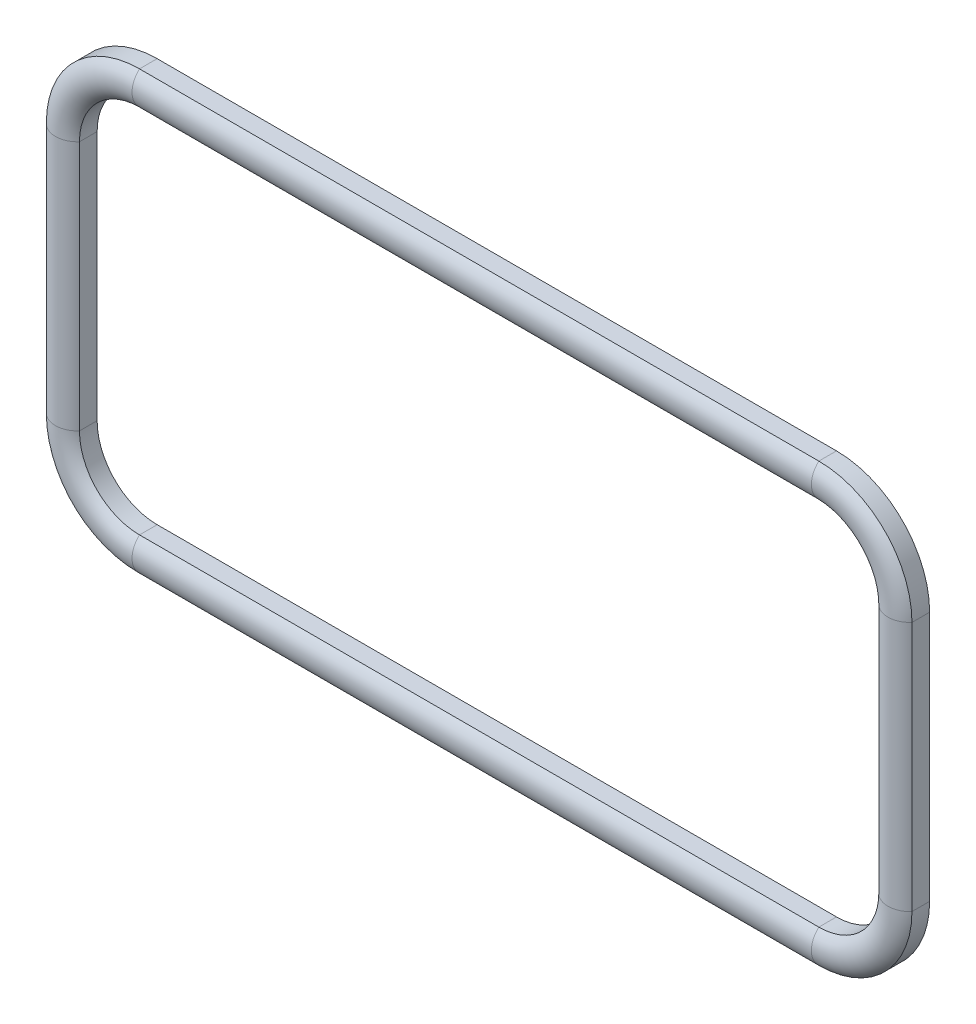
ISO-10303-21;
HEADER;
FILE_DESCRIPTION(('STEP AP214'),'2;1');
FILE_NAME('part.step','',(''),(''),'','','');
FILE_SCHEMA(('AUTOMOTIVE_DESIGN { 1 0 10303 214 1 1 1 1 }'));
ENDSEC;
DATA;
#1=APPLICATION_CONTEXT('core data for automotive mechanical design processes');
#2=APPLICATION_PROTOCOL_DEFINITION('international standard','automotive_design',2000,#1);
#3=PRODUCT_CONTEXT('',#1,'mechanical');
#4=PRODUCT('Part','Part','',(#3));
#5=PRODUCT_RELATED_PRODUCT_CATEGORY('part','',(#4));
#6=PRODUCT_DEFINITION_FORMATION('','',#4);
#7=PRODUCT_DEFINITION_CONTEXT('part definition',#1,'design');
#8=PRODUCT_DEFINITION('design','',#6,#7);
#9=PRODUCT_DEFINITION_SHAPE('','',#8);
#10=(LENGTH_UNIT() NAMED_UNIT(*) SI_UNIT(.MILLI.,.METRE.));
#11=(NAMED_UNIT(*) PLANE_ANGLE_UNIT() SI_UNIT($,.RADIAN.));
#12=(NAMED_UNIT(*) SI_UNIT($,.STERADIAN.) SOLID_ANGLE_UNIT());
#13=UNCERTAINTY_MEASURE_WITH_UNIT(LENGTH_MEASURE(1.E-05),#10,'distance_accuracy_value','');
#14=(GEOMETRIC_REPRESENTATION_CONTEXT(3) GLOBAL_UNCERTAINTY_ASSIGNED_CONTEXT((#13)) GLOBAL_UNIT_ASSIGNED_CONTEXT((#10,
#11,#12)) REPRESENTATION_CONTEXT('',''));
#15=CARTESIAN_POINT('',(0.,0.,0.));
#16=DIRECTION('',(0.,0.,1.));
#17=DIRECTION('',(1.,0.,0.));
#18=AXIS2_PLACEMENT_3D('',#15,#16,#17);
#19=CARTESIAN_POINT('',(-17.9451,-5.39749999999998,-0.224392713165355));
#20=DIRECTION('',(0.,1.,0.));
#21=DIRECTION('',(0.,0.,1.));
#22=AXIS2_PLACEMENT_3D('',#19,#20,#21);
#23=CYLINDRICAL_SURFACE('',#22,0.952336168749449);
#24=DIRECTION('',(0.,1.,0.));
#25=VECTOR('',#24,1.);
#26=CARTESIAN_POINT('',(-17.2316262924775,-5.39749999999998,0.4064));
#27=LINE('',#26,#25);
#28=CARTESIAN_POINT('',(-17.2316262924775,5.39750000000001,0.406399999999999));
#29=VERTEX_POINT('',#28);
#30=CARTESIAN_POINT('',(-17.2316262924775,-5.39749999999998,0.4064));
#31=VERTEX_POINT('',#30);
#32=EDGE_CURVE('E138',#29,#31,#27,.F.);
#33=ORIENTED_EDGE('',*,*,#32,.F.);
#34=CARTESIAN_POINT('',(-17.9451,5.39749999999998,-0.224392713165355));
#35=DIRECTION('',(0.,-1.,0.));
#36=DIRECTION('',(-1.,0.,0.));
#37=AXIS2_PLACEMENT_3D('',#34,#35,#36);
#38=CIRCLE('',#37,0.952336168749449);
#39=CARTESIAN_POINT('',(-18.6585737075225,5.39749999999995,0.4064));
#40=VERTEX_POINT('',#39);
#41=EDGE_CURVE('E294',#40,#29,#38,.F.);
#42=ORIENTED_EDGE('',*,*,#41,.F.);
#43=DIRECTION('',(0.,1.,0.));
#44=VECTOR('',#43,1.);
#45=CARTESIAN_POINT('',(-18.6585737075225,-5.39749999999998,0.4064));
#46=LINE('',#45,#44);
#47=CARTESIAN_POINT('',(-18.6585737075225,-5.39749999999998,0.4064));
#48=VERTEX_POINT('',#47);
#49=EDGE_CURVE('E141',#48,#40,#46,.T.);
#50=ORIENTED_EDGE('',*,*,#49,.F.);
#51=CARTESIAN_POINT('',(-17.9451,-5.39749999999997,-0.224392713165355));
#52=DIRECTION('',(0.,-1.,0.));
#53=DIRECTION('',(-1.,0.,0.));
#54=AXIS2_PLACEMENT_3D('',#51,#52,#53);
#55=CIRCLE('',#54,0.952336168749449);
#56=EDGE_CURVE('E134',#31,#48,#55,.T.);
#57=ORIENTED_EDGE('',*,*,#56,.F.);
#58=EDGE_LOOP('',(#33,#42,#50,#57));
#59=FACE_BOUND('',#58,.T.);
#60=ADVANCED_FACE('F16',(#59),#23,.T.);
#61=CARTESIAN_POINT('',(-14.6431,-5.3975,-0.224392713165355));
#62=DIRECTION('',(0.,0.,1.));
#63=DIRECTION('',(1.,0.,0.));
#64=AXIS2_PLACEMENT_3D('',#61,#62,#63);
#65=TOROIDAL_SURFACE('',#64,3.302,0.952336168749449);
#66=CARTESIAN_POINT('',(-14.6431,-5.3975,0.4064));
#67=DIRECTION('',(0.,0.,1.));
#68=DIRECTION('',(1.,0.,0.));
#69=AXIS2_PLACEMENT_3D('',#66,#67,#68);
#70=CIRCLE('',#69,2.58852629247752);
#71=CARTESIAN_POINT('',(-14.6431,-7.98602629247752,0.4064));
#72=VERTEX_POINT('',#71);
#73=EDGE_CURVE('E147',#72,#31,#70,.F.);
#74=ORIENTED_EDGE('',*,*,#73,.T.);
#75=ORIENTED_EDGE('',*,*,#56,.T.);
#76=CARTESIAN_POINT('',(-14.6431,-5.3975,0.4064));
#77=DIRECTION('',(0.,0.,1.));
#78=DIRECTION('',(1.,0.,0.));
#79=AXIS2_PLACEMENT_3D('',#76,#77,#78);
#80=CIRCLE('',#79,4.01547370752248);
#81=CARTESIAN_POINT('',(-14.6431,-9.41297370752248,0.4064));
#82=VERTEX_POINT('',#81);
#83=EDGE_CURVE('E292',#82,#48,#80,.F.);
#84=ORIENTED_EDGE('',*,*,#83,.F.);
#85=CARTESIAN_POINT('',(-14.6431,-8.6995,-0.224392713165355));
#86=DIRECTION('',(1.,0.,0.));
#87=DIRECTION('',(0.,1.,0.));
#88=AXIS2_PLACEMENT_3D('',#85,#86,#87);
#89=CIRCLE('',#88,0.952336168749449);
#90=EDGE_CURVE('E144',#72,#82,#89,.T.);
#91=ORIENTED_EDGE('',*,*,#90,.F.);
#92=EDGE_LOOP('',(#74,#75,#84,#91));
#93=FACE_BOUND('',#92,.T.);
#94=ADVANCED_FACE('F148',(#93),#65,.T.);
#95=CARTESIAN_POINT('',(-14.6431,-8.6995,-0.224392713165355));
#96=DIRECTION('',(1.,0.,0.));
#97=DIRECTION('',(0.,1.,0.));
#98=AXIS2_PLACEMENT_3D('',#95,#96,#97);
#99=CYLINDRICAL_SURFACE('',#98,0.952336168749449);
#100=CARTESIAN_POINT('',(14.6431,-8.6995,-0.224392713165355));
#101=DIRECTION('',(1.,0.,0.));
#102=DIRECTION('',(0.,-1.,0.));
#103=AXIS2_PLACEMENT_3D('',#100,#101,#102);
#104=CIRCLE('',#103,0.952336168749449);
#105=CARTESIAN_POINT('',(14.6431,-7.98602629247752,0.4064));
#106=VERTEX_POINT('',#105);
#107=CARTESIAN_POINT('',(14.6431,-9.41297370752248,0.4064));
#108=VERTEX_POINT('',#107);
#109=EDGE_CURVE('E268',#106,#108,#104,.T.);
#110=ORIENTED_EDGE('',*,*,#109,.F.);
#111=DIRECTION('',(1.,0.,0.));
#112=VECTOR('',#111,1.);
#113=CARTESIAN_POINT('',(-14.6431,-7.98602629247752,0.4064));
#114=LINE('',#113,#112);
#115=EDGE_CURVE('E168',#106,#72,#114,.F.);
#116=ORIENTED_EDGE('',*,*,#115,.T.);
#117=ORIENTED_EDGE('',*,*,#90,.T.);
#118=DIRECTION('',(-1.,0.,0.));
#119=VECTOR('',#118,1.);
#120=CARTESIAN_POINT('',(-14.6431,-9.41297370752248,0.4064));
#121=LINE('',#120,#119);
#122=EDGE_CURVE('E180',#82,#108,#121,.F.);
#123=ORIENTED_EDGE('',*,*,#122,.T.);
#124=EDGE_LOOP('',(#110,#116,#117,#123));
#125=FACE_BOUND('',#124,.T.);
#126=ADVANCED_FACE('F279',(#125),#99,.T.);
#127=CARTESIAN_POINT('',(14.6431,-5.3975,-0.224392713165355));
#128=DIRECTION('',(0.,0.,1.));
#129=DIRECTION('',(1.,0.,0.));
#130=AXIS2_PLACEMENT_3D('',#127,#128,#129);
#131=TOROIDAL_SURFACE('',#130,3.302,0.952336168749449);
#132=CARTESIAN_POINT('',(17.9451,-5.3975,-0.224392713165355));
#133=DIRECTION('',(0.,1.,0.));
#134=DIRECTION('',(0.,0.,1.));
#135=AXIS2_PLACEMENT_3D('',#132,#133,#134);
#136=CIRCLE('',#135,0.952336168749449);
#137=CARTESIAN_POINT('',(17.2316262924775,-5.3975,0.4064));
#138=VERTEX_POINT('',#137);
#139=CARTESIAN_POINT('',(18.6585737075225,-5.39749999999999,0.4064));
#140=VERTEX_POINT('',#139);
#141=EDGE_CURVE('E258',#138,#140,#136,.T.);
#142=ORIENTED_EDGE('',*,*,#141,.F.);
#143=CARTESIAN_POINT('',(14.6431,-5.3975,0.4064));
#144=DIRECTION('',(0.,0.,1.));
#145=DIRECTION('',(1.,0.,0.));
#146=AXIS2_PLACEMENT_3D('',#143,#144,#145);
#147=CIRCLE('',#146,2.58852629247752);
#148=EDGE_CURVE('E261',#138,#106,#147,.F.);
#149=ORIENTED_EDGE('',*,*,#148,.T.);
#150=ORIENTED_EDGE('',*,*,#109,.T.);
#151=CARTESIAN_POINT('',(14.6431,-5.3975,0.4064));
#152=DIRECTION('',(0.,0.,1.));
#153=DIRECTION('',(1.,0.,0.));
#154=AXIS2_PLACEMENT_3D('',#151,#152,#153);
#155=CIRCLE('',#154,4.01547370752248);
#156=EDGE_CURVE('E189',#140,#108,#155,.F.);
#157=ORIENTED_EDGE('',*,*,#156,.F.);
#158=EDGE_LOOP('',(#142,#149,#150,#157));
#159=FACE_BOUND('',#158,.T.);
#160=ADVANCED_FACE('F276',(#159),#131,.T.);
#161=CARTESIAN_POINT('',(17.9451,-5.39749999999998,-0.224392713165355));
#162=DIRECTION('',(0.,1.,0.));
#163=DIRECTION('',(0.,0.,1.));
#164=AXIS2_PLACEMENT_3D('',#161,#162,#163);
#165=CYLINDRICAL_SURFACE('',#164,0.952336168749449);
#166=CARTESIAN_POINT('',(17.9451,5.3975,-0.224392713165355));
#167=DIRECTION('',(0.,1.,0.));
#168=DIRECTION('',(1.,0.,0.));
#169=AXIS2_PLACEMENT_3D('',#166,#167,#168);
#170=CIRCLE('',#169,0.952336168749449);
#171=CARTESIAN_POINT('',(17.2316262924775,5.3975,0.4064));
#172=VERTEX_POINT('',#171);
#173=CARTESIAN_POINT('',(18.6585737075225,5.3975,0.4064));
#174=VERTEX_POINT('',#173);
#175=EDGE_CURVE('E255',#172,#174,#170,.T.);
#176=ORIENTED_EDGE('',*,*,#175,.F.);
#177=DIRECTION('',(0.,1.,0.));
#178=VECTOR('',#177,1.);
#179=CARTESIAN_POINT('',(17.2316262924775,-5.3975,0.4064));
#180=LINE('',#179,#178);
#181=EDGE_CURVE('E368',#172,#138,#180,.F.);
#182=ORIENTED_EDGE('',*,*,#181,.T.);
#183=ORIENTED_EDGE('',*,*,#141,.T.);
#184=DIRECTION('',(0.,1.,0.));
#185=VECTOR('',#184,1.);
#186=CARTESIAN_POINT('',(18.6585737075225,-5.39749999999996,0.4064));
#187=LINE('',#186,#185);
#188=EDGE_CURVE('E194',#140,#174,#187,.T.);
#189=ORIENTED_EDGE('',*,*,#188,.T.);
#190=EDGE_LOOP('',(#176,#182,#183,#189));
#191=FACE_BOUND('',#190,.T.);
#192=ADVANCED_FACE('F247',(#191),#165,.T.);
#193=CARTESIAN_POINT('',(14.6431,5.3975,-0.224392713165355));
#194=DIRECTION('',(0.,0.,1.));
#195=DIRECTION('',(1.,0.,0.));
#196=AXIS2_PLACEMENT_3D('',#193,#194,#195);
#197=TOROIDAL_SURFACE('',#196,3.302,0.952336168749449);
#198=CARTESIAN_POINT('',(14.6431,5.3975,0.4064));
#199=DIRECTION('',(0.,0.,1.));
#200=DIRECTION('',(1.,0.,0.));
#201=AXIS2_PLACEMENT_3D('',#198,#199,#200);
#202=CIRCLE('',#201,2.58852629247753);
#203=CARTESIAN_POINT('',(14.6431,7.98602629247753,0.4064));
#204=VERTEX_POINT('',#203);
#205=EDGE_CURVE('E363',#204,#172,#202,.F.);
#206=ORIENTED_EDGE('',*,*,#205,.T.);
#207=ORIENTED_EDGE('',*,*,#175,.T.);
#208=CARTESIAN_POINT('',(14.6431,5.3975,0.4064));
#209=DIRECTION('',(0.,0.,1.));
#210=DIRECTION('',(1.,0.,0.));
#211=AXIS2_PLACEMENT_3D('',#208,#209,#210);
#212=CIRCLE('',#211,4.01547370752248);
#213=CARTESIAN_POINT('',(14.6431,9.41297370752248,0.4064));
#214=VERTEX_POINT('',#213);
#215=EDGE_CURVE('E200',#214,#174,#212,.F.);
#216=ORIENTED_EDGE('',*,*,#215,.F.);
#217=CARTESIAN_POINT('',(14.6431,8.69950000000001,-0.224392713165355));
#218=DIRECTION('',(-1.,0.,0.));
#219=DIRECTION('',(0.,-1.,0.));
#220=AXIS2_PLACEMENT_3D('',#217,#218,#219);
#221=CIRCLE('',#220,0.952336168749449);
#222=EDGE_CURVE('E257',#204,#214,#221,.T.);
#223=ORIENTED_EDGE('',*,*,#222,.F.);
#224=EDGE_LOOP('',(#206,#207,#216,#223));
#225=FACE_BOUND('',#224,.T.);
#226=ADVANCED_FACE('F243',(#225),#197,.T.);
#227=CARTESIAN_POINT('',(14.6431,8.69950000000001,-0.224392713165355));
#228=DIRECTION('',(-1.,0.,0.));
#229=DIRECTION('',(0.,-1.,0.));
#230=AXIS2_PLACEMENT_3D('',#227,#228,#229);
#231=CYLINDRICAL_SURFACE('',#230,0.952336168749449);
#232=CARTESIAN_POINT('',(-14.6430999999999,8.6995,-0.224392713165355));
#233=DIRECTION('',(-1.,0.,0.));
#234=DIRECTION('',(0.,1.,0.));
#235=AXIS2_PLACEMENT_3D('',#232,#233,#234);
#236=CIRCLE('',#235,0.952336168749449);
#237=CARTESIAN_POINT('',(-14.6430999999999,7.98602629247752,0.4064));
#238=VERTEX_POINT('',#237);
#239=CARTESIAN_POINT('',(-14.6431,9.41297370752248,0.4064));
#240=VERTEX_POINT('',#239);
#241=EDGE_CURVE('E92',#238,#240,#236,.T.);
#242=ORIENTED_EDGE('',*,*,#241,.F.);
#243=DIRECTION('',(-1.,0.,0.));
#244=VECTOR('',#243,1.);
#245=CARTESIAN_POINT('',(14.6431,7.98602629247753,0.4064));
#246=LINE('',#245,#244);
#247=EDGE_CURVE('E219',#238,#204,#246,.F.);
#248=ORIENTED_EDGE('',*,*,#247,.T.);
#249=ORIENTED_EDGE('',*,*,#222,.T.);
#250=DIRECTION('',(1.,0.,0.));
#251=VECTOR('',#250,1.);
#252=CARTESIAN_POINT('',(14.6431,9.41297370752248,0.4064));
#253=LINE('',#252,#251);
#254=EDGE_CURVE('E205',#214,#240,#253,.F.);
#255=ORIENTED_EDGE('',*,*,#254,.T.);
#256=EDGE_LOOP('',(#242,#248,#249,#255));
#257=FACE_BOUND('',#256,.T.);
#258=ADVANCED_FACE('F238',(#257),#231,.T.);
#259=CARTESIAN_POINT('',(-14.6431,5.3975,-0.224392713165355));
#260=DIRECTION('',(0.,0.,1.));
#261=DIRECTION('',(1.,0.,0.));
#262=AXIS2_PLACEMENT_3D('',#259,#260,#261);
#263=TOROIDAL_SURFACE('',#262,3.302,0.952336168749449);
#264=ORIENTED_EDGE('',*,*,#41,.T.);
#265=CARTESIAN_POINT('',(-14.6431,5.3975,0.4064));
#266=DIRECTION('',(0.,0.,1.));
#267=DIRECTION('',(1.,0.,0.));
#268=AXIS2_PLACEMENT_3D('',#265,#266,#267);
#269=CIRCLE('',#268,2.58852629247753);
#270=EDGE_CURVE('E225',#29,#238,#269,.F.);
#271=ORIENTED_EDGE('',*,*,#270,.T.);
#272=ORIENTED_EDGE('',*,*,#241,.T.);
#273=CARTESIAN_POINT('',(-14.6431,5.3975,0.4064));
#274=DIRECTION('',(0.,0.,1.));
#275=DIRECTION('',(1.,0.,0.));
#276=AXIS2_PLACEMENT_3D('',#273,#274,#275);
#277=CIRCLE('',#276,4.01547370752248);
#278=EDGE_CURVE('E211',#40,#240,#277,.F.);
#279=ORIENTED_EDGE('',*,*,#278,.F.);
#280=EDGE_LOOP('',(#264,#271,#272,#279));
#281=FACE_BOUND('',#280,.T.);
#282=ADVANCED_FACE('F233',(#281),#263,.T.);
#283=CARTESIAN_POINT('',(-14.6431,-5.3975,0.));
#284=DIRECTION('',(0.,0.,1.));
#285=DIRECTION('',(1.,0.,0.));
#286=AXIS2_PLACEMENT_3D('',#283,#284,#285);
#287=CYLINDRICAL_SURFACE('',#286,4.01547370752248);
#288=DIRECTION('',(0.,0.,1.));
#289=VECTOR('',#288,1.);
#290=CARTESIAN_POINT('',(-14.6431,-9.41297370752248,-0.3556));
#291=LINE('',#290,#289);
#292=CARTESIAN_POINT('',(-14.6431,-9.41297370752248,-0.3556));
#293=VERTEX_POINT('',#292);
#294=EDGE_CURVE('E162',#293,#82,#291,.T.);
#295=ORIENTED_EDGE('',*,*,#294,.T.);
#296=ORIENTED_EDGE('',*,*,#83,.T.);
#297=DIRECTION('',(0.,0.,1.));
#298=VECTOR('',#297,1.);
#299=CARTESIAN_POINT('',(-18.6585737075225,-5.39749999999998,-0.3556));
#300=LINE('',#299,#298);
#301=CARTESIAN_POINT('',(-18.6585737075225,-5.39749999999999,-0.3556));
#302=VERTEX_POINT('',#301);
#303=EDGE_CURVE('E212',#302,#48,#300,.T.);
#304=ORIENTED_EDGE('',*,*,#303,.F.);
#305=CARTESIAN_POINT('',(-14.6431,-5.3975,-0.3556));
#306=DIRECTION('',(0.,0.,1.));
#307=DIRECTION('',(1.,0.,0.));
#308=AXIS2_PLACEMENT_3D('',#305,#306,#307);
#309=CIRCLE('',#308,4.01547370752248);
#310=EDGE_CURVE('E19',#293,#302,#309,.F.);
#311=ORIENTED_EDGE('',*,*,#310,.F.);
#312=EDGE_LOOP('',(#295,#296,#304,#311));
#313=FACE_BOUND('',#312,.T.);
#314=ADVANCED_FACE('F237',(#313),#287,.T.);
#315=CARTESIAN_POINT('',(-18.6585737075225,-5.39749999999998,-0.3556));
#316=DIRECTION('',(-1.,0.,0.));
#317=DIRECTION('',(0.,0.,1.));
#318=AXIS2_PLACEMENT_3D('',#315,#316,#317);
#319=PLANE('',#318);
#320=DIRECTION('',(0.,1.,0.));
#321=VECTOR('',#320,1.);
#322=CARTESIAN_POINT('',(-18.6585737075225,-5.39749999999998,-0.3556));
#323=LINE('',#322,#321);
#324=CARTESIAN_POINT('',(-18.6585737075225,5.39749999999997,-0.3556));
#325=VERTEX_POINT('',#324);
#326=EDGE_CURVE('E343',#302,#325,#323,.T.);
#327=ORIENTED_EDGE('',*,*,#326,.F.);
#328=ORIENTED_EDGE('',*,*,#303,.T.);
#329=ORIENTED_EDGE('',*,*,#49,.T.);
#330=DIRECTION('',(0.,0.,1.));
#331=VECTOR('',#330,1.);
#332=CARTESIAN_POINT('',(-18.6585737075225,5.39749999999995,0.));
#333=LINE('',#332,#331);
#334=EDGE_CURVE('E208',#325,#40,#333,.T.);
#335=ORIENTED_EDGE('',*,*,#334,.F.);
#336=EDGE_LOOP('',(#327,#328,#329,#335));
#337=FACE_BOUND('',#336,.T.);
#338=ADVANCED_FACE('F406',(#337),#319,.T.);
#339=CARTESIAN_POINT('',(-14.6431,5.3975,0.));
#340=DIRECTION('',(0.,0.,1.));
#341=DIRECTION('',(1.,0.,0.));
#342=AXIS2_PLACEMENT_3D('',#339,#340,#341);
#343=CYLINDRICAL_SURFACE('',#342,4.01547370752248);
#344=ORIENTED_EDGE('',*,*,#334,.T.);
#345=ORIENTED_EDGE('',*,*,#278,.T.);
#346=DIRECTION('',(0.,0.,1.));
#347=VECTOR('',#346,1.);
#348=CARTESIAN_POINT('',(-14.6431,9.41297370752248,-0.3556));
#349=LINE('',#348,#347);
#350=CARTESIAN_POINT('',(-14.6431,9.41297370752248,-0.3556));
#351=VERTEX_POINT('',#350);
#352=EDGE_CURVE('E201',#240,#351,#349,.F.);
#353=ORIENTED_EDGE('',*,*,#352,.T.);
#354=CARTESIAN_POINT('',(-14.6431,5.3975,-0.3556));
#355=DIRECTION('',(0.,0.,1.));
#356=DIRECTION('',(1.,0.,0.));
#357=AXIS2_PLACEMENT_3D('',#354,#355,#356);
#358=CIRCLE('',#357,4.01547370752248);
#359=EDGE_CURVE('E341',#325,#351,#358,.F.);
#360=ORIENTED_EDGE('',*,*,#359,.F.);
#361=EDGE_LOOP('',(#344,#345,#353,#360));
#362=FACE_BOUND('',#361,.T.);
#363=ADVANCED_FACE('F409',(#362),#343,.T.);
#364=CARTESIAN_POINT('',(14.6431,9.41297370752248,-0.3556));
#365=DIRECTION('',(0.,-1.,0.));
#366=DIRECTION('',(1.,0.,0.));
#367=AXIS2_PLACEMENT_3D('',#364,#365,#366);
#368=PLANE('',#367);
#369=DIRECTION('',(-1.,0.,0.));
#370=VECTOR('',#369,1.);
#371=CARTESIAN_POINT('',(-18.6585737075225,9.41297370752248,-0.3556));
#372=LINE('',#371,#370);
#373=CARTESIAN_POINT('',(14.6431,9.41297370752248,-0.3556));
#374=VERTEX_POINT('',#373);
#375=EDGE_CURVE('E340',#351,#374,#372,.F.);
#376=ORIENTED_EDGE('',*,*,#375,.F.);
#377=ORIENTED_EDGE('',*,*,#352,.F.);
#378=ORIENTED_EDGE('',*,*,#254,.F.);
#379=DIRECTION('',(0.,0.,1.));
#380=VECTOR('',#379,1.);
#381=CARTESIAN_POINT('',(14.6431,9.41297370752248,0.));
#382=LINE('',#381,#380);
#383=EDGE_CURVE('E197',#374,#214,#382,.T.);
#384=ORIENTED_EDGE('',*,*,#383,.F.);
#385=EDGE_LOOP('',(#376,#377,#378,#384));
#386=FACE_BOUND('',#385,.T.);
#387=ADVANCED_FACE('F414',(#386),#368,.F.);
#388=CARTESIAN_POINT('',(14.6431,5.3975,0.));
#389=DIRECTION('',(0.,0.,1.));
#390=DIRECTION('',(1.,0.,0.));
#391=AXIS2_PLACEMENT_3D('',#388,#389,#390);
#392=CYLINDRICAL_SURFACE('',#391,4.01547370752248);
#393=ORIENTED_EDGE('',*,*,#383,.T.);
#394=ORIENTED_EDGE('',*,*,#215,.T.);
#395=DIRECTION('',(0.,0.,1.));
#396=VECTOR('',#395,1.);
#397=CARTESIAN_POINT('',(18.6585737075225,5.39749999999999,-0.3556));
#398=LINE('',#397,#396);
#399=CARTESIAN_POINT('',(18.6585737075225,5.3975,-0.3556));
#400=VERTEX_POINT('',#399);
#401=EDGE_CURVE('E190',#174,#400,#398,.F.);
#402=ORIENTED_EDGE('',*,*,#401,.T.);
#403=CARTESIAN_POINT('',(14.6431,5.3975,-0.3556));
#404=DIRECTION('',(0.,0.,1.));
#405=DIRECTION('',(1.,0.,0.));
#406=AXIS2_PLACEMENT_3D('',#403,#404,#405);
#407=CIRCLE('',#406,4.01547370752248);
#408=EDGE_CURVE('E338',#374,#400,#407,.F.);
#409=ORIENTED_EDGE('',*,*,#408,.F.);
#410=EDGE_LOOP('',(#393,#394,#402,#409));
#411=FACE_BOUND('',#410,.T.);
#412=ADVANCED_FACE('F417',(#411),#392,.T.);
#413=CARTESIAN_POINT('',(18.6585737075225,-5.39749999999996,-0.3556));
#414=DIRECTION('',(-1.,0.,0.));
#415=DIRECTION('',(0.,0.,1.));
#416=AXIS2_PLACEMENT_3D('',#413,#414,#415);
#417=PLANE('',#416);
#418=DIRECTION('',(0.,1.,0.));
#419=VECTOR('',#418,1.);
#420=CARTESIAN_POINT('',(18.6585737075225,-5.39749999999998,-0.3556));
#421=LINE('',#420,#419);
#422=CARTESIAN_POINT('',(18.6585737075225,-5.3975,-0.3556));
#423=VERTEX_POINT('',#422);
#424=EDGE_CURVE('E337',#400,#423,#421,.F.);
#425=ORIENTED_EDGE('',*,*,#424,.F.);
#426=ORIENTED_EDGE('',*,*,#401,.F.);
#427=ORIENTED_EDGE('',*,*,#188,.F.);
#428=DIRECTION('',(0.,0.,1.));
#429=VECTOR('',#428,1.);
#430=CARTESIAN_POINT('',(18.6585737075225,-5.3975,0.));
#431=LINE('',#430,#429);
#432=EDGE_CURVE('E186',#423,#140,#431,.T.);
#433=ORIENTED_EDGE('',*,*,#432,.F.);
#434=EDGE_LOOP('',(#425,#426,#427,#433));
#435=FACE_BOUND('',#434,.T.);
#436=ADVANCED_FACE('F394',(#435),#417,.F.);
#437=CARTESIAN_POINT('',(14.6431,-5.3975,0.));
#438=DIRECTION('',(0.,0.,1.));
#439=DIRECTION('',(1.,0.,0.));
#440=AXIS2_PLACEMENT_3D('',#437,#438,#439);
#441=CYLINDRICAL_SURFACE('',#440,4.01547370752248);
#442=ORIENTED_EDGE('',*,*,#432,.T.);
#443=ORIENTED_EDGE('',*,*,#156,.T.);
#444=DIRECTION('',(0.,0.,1.));
#445=VECTOR('',#444,1.);
#446=CARTESIAN_POINT('',(14.6431,-9.41297370752248,-0.3556));
#447=LINE('',#446,#445);
#448=CARTESIAN_POINT('',(14.6431,-9.41297370752248,-0.3556));
#449=VERTEX_POINT('',#448);
#450=EDGE_CURVE('E178',#108,#449,#447,.F.);
#451=ORIENTED_EDGE('',*,*,#450,.T.);
#452=CARTESIAN_POINT('',(14.6431,-5.3975,-0.3556));
#453=DIRECTION('',(0.,0.,1.));
#454=DIRECTION('',(1.,0.,0.));
#455=AXIS2_PLACEMENT_3D('',#452,#453,#454);
#456=CIRCLE('',#455,4.01547370752248);
#457=EDGE_CURVE('E333',#423,#449,#456,.F.);
#458=ORIENTED_EDGE('',*,*,#457,.F.);
#459=EDGE_LOOP('',(#442,#443,#451,#458));
#460=FACE_BOUND('',#459,.T.);
#461=ADVANCED_FACE('F398',(#460),#441,.T.);
#462=CARTESIAN_POINT('',(-14.6431,-9.41297370752248,-0.3556));
#463=DIRECTION('',(0.,1.,0.));
#464=DIRECTION('',(-1.,0.,0.));
#465=AXIS2_PLACEMENT_3D('',#462,#463,#464);
#466=PLANE('',#465);
#467=DIRECTION('',(-1.,0.,0.));
#468=VECTOR('',#467,1.);
#469=CARTESIAN_POINT('',(-18.6585737075225,-9.41297370752248,-0.3556));
#470=LINE('',#469,#468);
#471=EDGE_CURVE('E336',#449,#293,#470,.T.);
#472=ORIENTED_EDGE('',*,*,#471,.F.);
#473=ORIENTED_EDGE('',*,*,#450,.F.);
#474=ORIENTED_EDGE('',*,*,#122,.F.);
#475=ORIENTED_EDGE('',*,*,#294,.F.);
#476=EDGE_LOOP('',(#472,#473,#474,#475));
#477=FACE_BOUND('',#476,.T.);
#478=ADVANCED_FACE('F403',(#477),#466,.F.);
#479=CARTESIAN_POINT('',(-17.2316262924775,-5.39749999999998,-0.3556));
#480=DIRECTION('',(1.,0.,0.));
#481=DIRECTION('',(0.,0.,-1.));
#482=AXIS2_PLACEMENT_3D('',#479,#480,#481);
#483=PLANE('',#482);
#484=ORIENTED_EDGE('',*,*,#32,.T.);
#485=DIRECTION('',(0.,0.,1.));
#486=VECTOR('',#485,1.);
#487=CARTESIAN_POINT('',(-17.2316262924775,-5.39749999999998,0.));
#488=LINE('',#487,#486);
#489=CARTESIAN_POINT('',(-17.2316262924775,-5.39749999999999,-0.3556));
#490=VERTEX_POINT('',#489);
#491=EDGE_CURVE('E154',#31,#490,#488,.F.);
#492=ORIENTED_EDGE('',*,*,#491,.T.);
#493=DIRECTION('',(0.,1.,0.));
#494=VECTOR('',#493,1.);
#495=CARTESIAN_POINT('',(-17.2316262924775,-5.39749999999998,-0.3556));
#496=LINE('',#495,#494);
#497=CARTESIAN_POINT('',(-17.2316262924775,5.39750000000001,-0.3556));
#498=VERTEX_POINT('',#497);
#499=EDGE_CURVE('E332',#498,#490,#496,.F.);
#500=ORIENTED_EDGE('',*,*,#499,.F.);
#501=DIRECTION('',(0.,0.,1.));
#502=VECTOR('',#501,1.);
#503=CARTESIAN_POINT('',(-17.2316262924775,5.39750000000002,0.));
#504=LINE('',#503,#502);
#505=EDGE_CURVE('E160',#498,#29,#504,.T.);
#506=ORIENTED_EDGE('',*,*,#505,.T.);
#507=EDGE_LOOP('',(#484,#492,#500,#506));
#508=FACE_BOUND('',#507,.T.);
#509=ADVANCED_FACE('F157',(#508),#483,.T.);
#510=CARTESIAN_POINT('',(-14.6431,-5.3975,0.));
#511=DIRECTION('',(0.,0.,1.));
#512=DIRECTION('',(1.,0.,0.));
#513=AXIS2_PLACEMENT_3D('',#510,#511,#512);
#514=CYLINDRICAL_SURFACE('',#513,2.58852629247752);
#515=ORIENTED_EDGE('',*,*,#73,.F.);
#516=DIRECTION('',(0.,0.,1.));
#517=VECTOR('',#516,1.);
#518=CARTESIAN_POINT('',(-14.6431,-7.98602629247752,-0.3556));
#519=LINE('',#518,#517);
#520=CARTESIAN_POINT('',(-14.6431,-7.98602629247752,-0.3556));
#521=VERTEX_POINT('',#520);
#522=EDGE_CURVE('E170',#72,#521,#519,.F.);
#523=ORIENTED_EDGE('',*,*,#522,.T.);
#524=CARTESIAN_POINT('',(-14.6431,-5.3975,-0.3556));
#525=DIRECTION('',(0.,0.,1.));
#526=DIRECTION('',(1.,0.,0.));
#527=AXIS2_PLACEMENT_3D('',#524,#525,#526);
#528=CIRCLE('',#527,2.58852629247752);
#529=EDGE_CURVE('E166',#490,#521,#528,.T.);
#530=ORIENTED_EDGE('',*,*,#529,.F.);
#531=ORIENTED_EDGE('',*,*,#491,.F.);
#532=EDGE_LOOP('',(#515,#523,#530,#531));
#533=FACE_BOUND('',#532,.T.);
#534=ADVANCED_FACE('F164',(#533),#514,.F.);
#535=CARTESIAN_POINT('',(-14.6431,-7.98602629247752,-0.3556));
#536=DIRECTION('',(0.,-1.,0.));
#537=DIRECTION('',(1.,0.,0.));
#538=AXIS2_PLACEMENT_3D('',#535,#536,#537);
#539=PLANE('',#538);
#540=ORIENTED_EDGE('',*,*,#115,.F.);
#541=DIRECTION('',(0.,0.,1.));
#542=VECTOR('',#541,1.);
#543=CARTESIAN_POINT('',(14.6431,-7.98602629247752,0.));
#544=LINE('',#543,#542);
#545=CARTESIAN_POINT('',(14.6431,-7.98602629247752,-0.3556));
#546=VERTEX_POINT('',#545);
#547=EDGE_CURVE('E264',#106,#546,#544,.F.);
#548=ORIENTED_EDGE('',*,*,#547,.T.);
#549=DIRECTION('',(-1.,0.,0.));
#550=VECTOR('',#549,1.);
#551=CARTESIAN_POINT('',(-18.6585737075225,-7.98602629247752,-0.3556));
#552=LINE('',#551,#550);
#553=EDGE_CURVE('E330',#521,#546,#552,.F.);
#554=ORIENTED_EDGE('',*,*,#553,.F.);
#555=ORIENTED_EDGE('',*,*,#522,.F.);
#556=EDGE_LOOP('',(#540,#548,#554,#555));
#557=FACE_BOUND('',#556,.T.);
#558=ADVANCED_FACE('F377',(#557),#539,.F.);
#559=CARTESIAN_POINT('',(14.6431,-5.3975,0.));
#560=DIRECTION('',(0.,0.,1.));
#561=DIRECTION('',(1.,0.,0.));
#562=AXIS2_PLACEMENT_3D('',#559,#560,#561);
#563=CYLINDRICAL_SURFACE('',#562,2.58852629247752);
#564=ORIENTED_EDGE('',*,*,#148,.F.);
#565=DIRECTION('',(0.,0.,-1.));
#566=VECTOR('',#565,1.);
#567=CARTESIAN_POINT('',(17.2316262924775,-5.3975,-0.3556));
#568=LINE('',#567,#566);
#569=CARTESIAN_POINT('',(17.2316262924775,-5.3975,-0.3556));
#570=VERTEX_POINT('',#569);
#571=EDGE_CURVE('E366',#138,#570,#568,.T.);
#572=ORIENTED_EDGE('',*,*,#571,.T.);
#573=CARTESIAN_POINT('',(14.6431,-5.3975,-0.3556));
#574=DIRECTION('',(0.,0.,1.));
#575=DIRECTION('',(1.,0.,0.));
#576=AXIS2_PLACEMENT_3D('',#573,#574,#575);
#577=CIRCLE('',#576,2.58852629247752);
#578=EDGE_CURVE('E327',#546,#570,#577,.T.);
#579=ORIENTED_EDGE('',*,*,#578,.F.);
#580=ORIENTED_EDGE('',*,*,#547,.F.);
#581=EDGE_LOOP('',(#564,#572,#579,#580));
#582=FACE_BOUND('',#581,.T.);
#583=ADVANCED_FACE('F428',(#582),#563,.F.);
#584=CARTESIAN_POINT('',(17.2316262924775,-5.3975,-0.3556));
#585=DIRECTION('',(1.,0.,0.));
#586=DIRECTION('',(0.,0.,-1.));
#587=AXIS2_PLACEMENT_3D('',#584,#585,#586);
#588=PLANE('',#587);
#589=ORIENTED_EDGE('',*,*,#181,.F.);
#590=DIRECTION('',(0.,0.,1.));
#591=VECTOR('',#590,1.);
#592=CARTESIAN_POINT('',(17.2316262924775,5.3975,0.));
#593=LINE('',#592,#591);
#594=CARTESIAN_POINT('',(17.2316262924775,5.3975,-0.3556));
#595=VERTEX_POINT('',#594);
#596=EDGE_CURVE('E222',#172,#595,#593,.F.);
#597=ORIENTED_EDGE('',*,*,#596,.T.);
#598=DIRECTION('',(0.,1.,0.));
#599=VECTOR('',#598,1.);
#600=CARTESIAN_POINT('',(17.2316262924775,-5.39749999999998,-0.3556));
#601=LINE('',#600,#599);
#602=EDGE_CURVE('E326',#570,#595,#601,.T.);
#603=ORIENTED_EDGE('',*,*,#602,.F.);
#604=ORIENTED_EDGE('',*,*,#571,.F.);
#605=EDGE_LOOP('',(#589,#597,#603,#604));
#606=FACE_BOUND('',#605,.T.);
#607=ADVANCED_FACE('F467',(#606),#588,.F.);
#608=CARTESIAN_POINT('',(14.6431,5.3975,0.));
#609=DIRECTION('',(0.,0.,1.));
#610=DIRECTION('',(1.,0.,0.));
#611=AXIS2_PLACEMENT_3D('',#608,#609,#610);
#612=CYLINDRICAL_SURFACE('',#611,2.58852629247753);
#613=ORIENTED_EDGE('',*,*,#205,.F.);
#614=DIRECTION('',(0.,0.,1.));
#615=VECTOR('',#614,1.);
#616=CARTESIAN_POINT('',(14.6431,7.98602629247753,-0.3556));
#617=LINE('',#616,#615);
#618=CARTESIAN_POINT('',(14.6431,7.98602629247753,-0.3556));
#619=VERTEX_POINT('',#618);
#620=EDGE_CURVE('E221',#204,#619,#617,.F.);
#621=ORIENTED_EDGE('',*,*,#620,.T.);
#622=CARTESIAN_POINT('',(14.6431,5.3975,-0.3556));
#623=DIRECTION('',(0.,0.,1.));
#624=DIRECTION('',(1.,0.,0.));
#625=AXIS2_PLACEMENT_3D('',#622,#623,#624);
#626=CIRCLE('',#625,2.58852629247753);
#627=EDGE_CURVE('E323',#595,#619,#626,.T.);
#628=ORIENTED_EDGE('',*,*,#627,.F.);
#629=ORIENTED_EDGE('',*,*,#596,.F.);
#630=EDGE_LOOP('',(#613,#621,#628,#629));
#631=FACE_BOUND('',#630,.T.);
#632=ADVANCED_FACE('F438',(#631),#612,.F.);
#633=CARTESIAN_POINT('',(14.6431,7.98602629247753,-0.3556));
#634=DIRECTION('',(0.,1.,0.));
#635=DIRECTION('',(-1.,0.,0.));
#636=AXIS2_PLACEMENT_3D('',#633,#634,#635);
#637=PLANE('',#636);
#638=ORIENTED_EDGE('',*,*,#247,.F.);
#639=DIRECTION('',(0.,0.,1.));
#640=VECTOR('',#639,1.);
#641=CARTESIAN_POINT('',(-14.6430999999999,7.98602629247752,0.));
#642=LINE('',#641,#640);
#643=CARTESIAN_POINT('',(-14.6431,7.98602629247753,-0.3556));
#644=VERTEX_POINT('',#643);
#645=EDGE_CURVE('E34',#238,#644,#642,.F.);
#646=ORIENTED_EDGE('',*,*,#645,.T.);
#647=DIRECTION('',(-1.,0.,0.));
#648=VECTOR('',#647,1.);
#649=CARTESIAN_POINT('',(-18.6585737075225,7.98602629247753,-0.3556));
#650=LINE('',#649,#648);
#651=EDGE_CURVE('E25',#619,#644,#650,.T.);
#652=ORIENTED_EDGE('',*,*,#651,.F.);
#653=ORIENTED_EDGE('',*,*,#620,.F.);
#654=EDGE_LOOP('',(#638,#646,#652,#653));
#655=FACE_BOUND('',#654,.T.);
#656=ADVANCED_FACE('F436',(#655),#637,.F.);
#657=CARTESIAN_POINT('',(-14.6431,5.3975,0.));
#658=DIRECTION('',(0.,0.,1.));
#659=DIRECTION('',(1.,0.,0.));
#660=AXIS2_PLACEMENT_3D('',#657,#658,#659);
#661=CYLINDRICAL_SURFACE('',#660,2.58852629247753);
#662=ORIENTED_EDGE('',*,*,#270,.F.);
#663=ORIENTED_EDGE('',*,*,#505,.F.);
#664=CARTESIAN_POINT('',(-14.6431,5.3975,-0.3556));
#665=DIRECTION('',(0.,0.,1.));
#666=DIRECTION('',(1.,0.,0.));
#667=AXIS2_PLACEMENT_3D('',#664,#665,#666);
#668=CIRCLE('',#667,2.58852629247753);
#669=EDGE_CURVE('E11',#644,#498,#668,.T.);
#670=ORIENTED_EDGE('',*,*,#669,.F.);
#671=ORIENTED_EDGE('',*,*,#645,.F.);
#672=EDGE_LOOP('',(#662,#663,#670,#671));
#673=FACE_BOUND('',#672,.T.);
#674=ADVANCED_FACE('F454',(#673),#661,.F.);
#675=CARTESIAN_POINT('',(-18.6585737075225,-5.39749999999998,-0.3556));
#676=DIRECTION('',(0.,0.,-1.));
#677=DIRECTION('',(-1.,0.,0.));
#678=AXIS2_PLACEMENT_3D('',#675,#676,#677);
#679=PLANE('',#678);
#680=ORIENTED_EDGE('',*,*,#651,.T.);
#681=ORIENTED_EDGE('',*,*,#669,.T.);
#682=ORIENTED_EDGE('',*,*,#499,.T.);
#683=ORIENTED_EDGE('',*,*,#529,.T.);
#684=ORIENTED_EDGE('',*,*,#553,.T.);
#685=ORIENTED_EDGE('',*,*,#578,.T.);
#686=ORIENTED_EDGE('',*,*,#602,.T.);
#687=ORIENTED_EDGE('',*,*,#627,.T.);
#688=EDGE_LOOP('',(#680,#681,#682,#683,#684,#685,#686,#687));
#689=FACE_BOUND('',#688,.T.);
#690=ORIENTED_EDGE('',*,*,#457,.T.);
#691=ORIENTED_EDGE('',*,*,#471,.T.);
#692=ORIENTED_EDGE('',*,*,#310,.T.);
#693=ORIENTED_EDGE('',*,*,#326,.T.);
#694=ORIENTED_EDGE('',*,*,#359,.T.);
#695=ORIENTED_EDGE('',*,*,#375,.T.);
#696=ORIENTED_EDGE('',*,*,#408,.T.);
#697=ORIENTED_EDGE('',*,*,#424,.T.);
#698=EDGE_LOOP('',(#690,#691,#692,#693,#694,#695,#696,#697));
#699=FACE_BOUND('',#698,.T.);
#700=ADVANCED_FACE('F383',(#689,#699),#679,.T.);
#701=CLOSED_SHELL('',(#60,#94,#126,#160,#192,#226,#258,#282,#314,#338,#363,#387,#412,#436,#461,
#478,#509,#534,#558,#583,#607,#632,#656,#674,#700));
#702=MANIFOLD_SOLID_BREP('B1',#701);
#703=ADVANCED_BREP_SHAPE_REPRESENTATION('',(#18,#702),#14);
#704=SHAPE_DEFINITION_REPRESENTATION(#9,#703);
ENDSEC;
END-ISO-10303-21;
